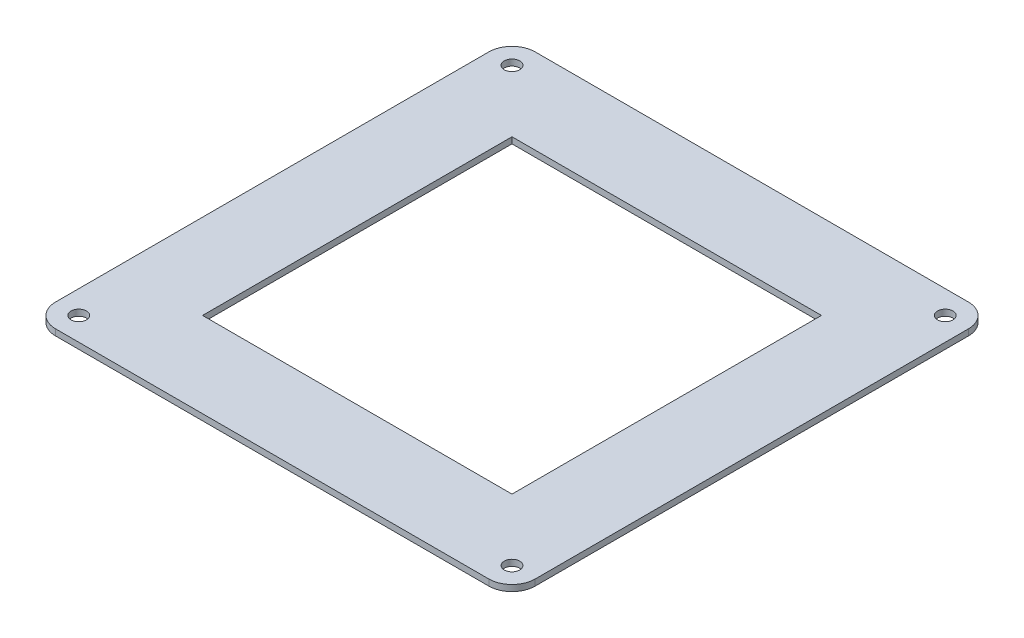
ISO-10303-21;
HEADER;
FILE_DESCRIPTION(('STEP AP214'),'2;1');
FILE_NAME('part.step','',(''),(''),'','','');
FILE_SCHEMA(('AUTOMOTIVE_DESIGN { 1 0 10303 214 1 1 1 1 }'));
ENDSEC;
DATA;
#1=APPLICATION_CONTEXT('core data for automotive mechanical design processes');
#2=APPLICATION_PROTOCOL_DEFINITION('international standard','automotive_design',2000,#1);
#3=PRODUCT_CONTEXT('',#1,'mechanical');
#4=PRODUCT('Part','Part','',(#3));
#5=PRODUCT_RELATED_PRODUCT_CATEGORY('part','',(#4));
#6=PRODUCT_DEFINITION_FORMATION('','',#4);
#7=PRODUCT_DEFINITION_CONTEXT('part definition',#1,'design');
#8=PRODUCT_DEFINITION('design','',#6,#7);
#9=PRODUCT_DEFINITION_SHAPE('','',#8);
#10=(LENGTH_UNIT() NAMED_UNIT(*) SI_UNIT(.MILLI.,.METRE.));
#11=(NAMED_UNIT(*) PLANE_ANGLE_UNIT() SI_UNIT($,.RADIAN.));
#12=(NAMED_UNIT(*) SI_UNIT($,.STERADIAN.) SOLID_ANGLE_UNIT());
#13=UNCERTAINTY_MEASURE_WITH_UNIT(LENGTH_MEASURE(1.E-05),#10,'distance_accuracy_value','');
#14=(GEOMETRIC_REPRESENTATION_CONTEXT(3) GLOBAL_UNCERTAINTY_ASSIGNED_CONTEXT((#13)) GLOBAL_UNIT_ASSIGNED_CONTEXT((#10,
#11,#12)) REPRESENTATION_CONTEXT('',''));
#15=CARTESIAN_POINT('',(0.,0.,0.));
#16=DIRECTION('',(0.,0.,1.));
#17=DIRECTION('',(1.,0.,0.));
#18=AXIS2_PLACEMENT_3D('',#15,#16,#17);
#19=CARTESIAN_POINT('',(17.5,2.,-157.5));
#20=DIRECTION('',(0.,1.,0.));
#21=DIRECTION('',(0.,0.,1.));
#22=AXIS2_PLACEMENT_3D('',#19,#20,#21);
#23=PLANE('',#22);
#24=DIRECTION('',(0.,0.,-1.));
#25=VECTOR('',#24,1.);
#26=CARTESIAN_POINT('',(137.5,2.,-37.5));
#27=LINE('',#26,#25);
#28=CARTESIAN_POINT('',(137.5,2.,-37.5));
#29=VERTEX_POINT('',#28);
#30=CARTESIAN_POINT('',(137.5,2.,-137.5));
#31=VERTEX_POINT('',#30);
#32=EDGE_CURVE('E47',#29,#31,#27,.T.);
#33=ORIENTED_EDGE('',*,*,#32,.F.);
#34=DIRECTION('',(1.,0.,0.));
#35=VECTOR('',#34,1.);
#36=CARTESIAN_POINT('',(37.5,2.,-37.5));
#37=LINE('',#36,#35);
#38=CARTESIAN_POINT('',(37.5,2.,-37.5));
#39=VERTEX_POINT('',#38);
#40=EDGE_CURVE('E139',#39,#29,#37,.T.);
#41=ORIENTED_EDGE('',*,*,#40,.F.);
#42=DIRECTION('',(0.,0.,1.));
#43=VECTOR('',#42,1.);
#44=CARTESIAN_POINT('',(37.5,2.,-37.5));
#45=LINE('',#44,#43);
#46=CARTESIAN_POINT('',(37.5,2.,-137.5));
#47=VERTEX_POINT('',#46);
#48=EDGE_CURVE('E124',#47,#39,#45,.T.);
#49=ORIENTED_EDGE('',*,*,#48,.F.);
#50=DIRECTION('',(-1.,0.,0.));
#51=VECTOR('',#50,1.);
#52=CARTESIAN_POINT('',(37.5,2.,-137.5));
#53=LINE('',#52,#51);
#54=EDGE_CURVE('E133',#31,#47,#53,.T.);
#55=ORIENTED_EDGE('',*,*,#54,.F.);
#56=EDGE_LOOP('',(#33,#41,#49,#55));
#57=FACE_BOUND('',#56,.T.);
#58=CARTESIAN_POINT('',(157.5,2.,-17.5));
#59=DIRECTION('',(0.,1.,0.));
#60=DIRECTION('',(0.,0.,1.));
#61=AXIS2_PLACEMENT_3D('',#58,#59,#60);
#62=CIRCLE('',#61,2.5);
#63=CARTESIAN_POINT('',(157.5,2.,-15.));
#64=VERTEX_POINT('',#63);
#65=EDGE_CURVE('E155',#64,#64,#62,.T.);
#66=ORIENTED_EDGE('',*,*,#65,.F.);
#67=EDGE_LOOP('',(#66));
#68=FACE_BOUND('',#67,.T.);
#69=CARTESIAN_POINT('',(17.5,2.,-157.5));
#70=DIRECTION('',(0.,1.,0.));
#71=DIRECTION('',(0.,0.,1.));
#72=AXIS2_PLACEMENT_3D('',#69,#70,#71);
#73=CIRCLE('',#72,2.5);
#74=CARTESIAN_POINT('',(17.5,2.,-155.));
#75=VERTEX_POINT('',#74);
#76=EDGE_CURVE('E167',#75,#75,#73,.T.);
#77=ORIENTED_EDGE('',*,*,#76,.F.);
#78=EDGE_LOOP('',(#77));
#79=FACE_BOUND('',#78,.T.);
#80=CARTESIAN_POINT('',(17.5,2.,-157.5));
#81=DIRECTION('',(0.,1.,0.));
#82=DIRECTION('',(0.,0.,1.));
#83=AXIS2_PLACEMENT_3D('',#80,#81,#82);
#84=CIRCLE('',#83,7.5);
#85=CARTESIAN_POINT('',(17.5,2.,-165.));
#86=VERTEX_POINT('',#85);
#87=CARTESIAN_POINT('',(10.,2.,-157.5));
#88=VERTEX_POINT('',#87);
#89=EDGE_CURVE('E173',#86,#88,#84,.T.);
#90=ORIENTED_EDGE('',*,*,#89,.T.);
#91=DIRECTION('',(0.,0.,1.));
#92=VECTOR('',#91,1.);
#93=CARTESIAN_POINT('',(10.,2.,-17.5));
#94=LINE('',#93,#92);
#95=CARTESIAN_POINT('',(10.,2.,-17.5));
#96=VERTEX_POINT('',#95);
#97=EDGE_CURVE('E176',#88,#96,#94,.T.);
#98=ORIENTED_EDGE('',*,*,#97,.T.);
#99=CARTESIAN_POINT('',(17.5,2.,-17.5));
#100=DIRECTION('',(0.,1.,0.));
#101=DIRECTION('',(0.,0.,1.));
#102=AXIS2_PLACEMENT_3D('',#99,#100,#101);
#103=CIRCLE('',#102,7.5);
#104=CARTESIAN_POINT('',(17.5,2.,-10.));
#105=VERTEX_POINT('',#104);
#106=EDGE_CURVE('E179',#96,#105,#103,.T.);
#107=ORIENTED_EDGE('',*,*,#106,.T.);
#108=DIRECTION('',(1.,0.,0.));
#109=VECTOR('',#108,1.);
#110=CARTESIAN_POINT('',(17.5,2.,-10.));
#111=LINE('',#110,#109);
#112=CARTESIAN_POINT('',(157.5,2.,-9.99999999999999));
#113=VERTEX_POINT('',#112);
#114=EDGE_CURVE('E181',#105,#113,#111,.T.);
#115=ORIENTED_EDGE('',*,*,#114,.T.);
#116=CARTESIAN_POINT('',(157.5,2.,-17.5));
#117=DIRECTION('',(0.,1.,0.));
#118=DIRECTION('',(0.,0.,1.));
#119=AXIS2_PLACEMENT_3D('',#116,#117,#118);
#120=CIRCLE('',#119,7.50000000000002);
#121=CARTESIAN_POINT('',(165.,2.,-17.5));
#122=VERTEX_POINT('',#121);
#123=EDGE_CURVE('E183',#113,#122,#120,.T.);
#124=ORIENTED_EDGE('',*,*,#123,.T.);
#125=DIRECTION('',(0.,0.,-1.));
#126=VECTOR('',#125,1.);
#127=CARTESIAN_POINT('',(165.,2.,-17.5));
#128=LINE('',#127,#126);
#129=CARTESIAN_POINT('',(165.,2.,-157.5));
#130=VERTEX_POINT('',#129);
#131=EDGE_CURVE('E185',#122,#130,#128,.T.);
#132=ORIENTED_EDGE('',*,*,#131,.T.);
#133=CARTESIAN_POINT('',(157.5,2.,-157.5));
#134=DIRECTION('',(0.,1.,0.));
#135=DIRECTION('',(0.,0.,1.));
#136=AXIS2_PLACEMENT_3D('',#133,#134,#135);
#137=CIRCLE('',#136,7.50000000000001);
#138=CARTESIAN_POINT('',(157.5,2.,-165.));
#139=VERTEX_POINT('',#138);
#140=EDGE_CURVE('E187',#130,#139,#137,.T.);
#141=ORIENTED_EDGE('',*,*,#140,.T.);
#142=DIRECTION('',(-1.,0.,0.));
#143=VECTOR('',#142,1.);
#144=CARTESIAN_POINT('',(17.5,2.,-165.));
#145=LINE('',#144,#143);
#146=EDGE_CURVE('E189',#139,#86,#145,.T.);
#147=ORIENTED_EDGE('',*,*,#146,.T.);
#148=EDGE_LOOP('',(#90,#98,#107,#115,#124,#132,#141,#147));
#149=FACE_BOUND('',#148,.T.);
#150=CARTESIAN_POINT('',(157.5,2.,-157.5));
#151=DIRECTION('',(0.,1.,0.));
#152=DIRECTION('',(0.,0.,1.));
#153=AXIS2_PLACEMENT_3D('',#150,#151,#152);
#154=CIRCLE('',#153,2.5);
#155=CARTESIAN_POINT('',(157.5,2.,-155.));
#156=VERTEX_POINT('',#155);
#157=EDGE_CURVE('E161',#156,#156,#154,.T.);
#158=ORIENTED_EDGE('',*,*,#157,.F.);
#159=EDGE_LOOP('',(#158));
#160=FACE_BOUND('',#159,.T.);
#161=CARTESIAN_POINT('',(17.5,2.,-17.5));
#162=DIRECTION('',(0.,1.,0.));
#163=DIRECTION('',(0.,0.,1.));
#164=AXIS2_PLACEMENT_3D('',#161,#162,#163);
#165=CIRCLE('',#164,2.5);
#166=CARTESIAN_POINT('',(17.5,2.,-15.));
#167=VERTEX_POINT('',#166);
#168=EDGE_CURVE('E149',#167,#167,#165,.T.);
#169=ORIENTED_EDGE('',*,*,#168,.F.);
#170=EDGE_LOOP('',(#169));
#171=FACE_BOUND('',#170,.T.);
#172=ADVANCED_FACE('F32',(#57,#68,#79,#149,#160,#171),#23,.T.);
#173=CARTESIAN_POINT('',(17.5,0.,-157.5));
#174=DIRECTION('',(0.,1.,0.));
#175=DIRECTION('',(0.,0.,1.));
#176=AXIS2_PLACEMENT_3D('',#173,#174,#175);
#177=PLANE('',#176);
#178=DIRECTION('',(1.,0.,0.));
#179=VECTOR('',#178,1.);
#180=CARTESIAN_POINT('',(17.5,0.,-37.5));
#181=LINE('',#180,#179);
#182=CARTESIAN_POINT('',(37.5,0.,-37.5));
#183=VERTEX_POINT('',#182);
#184=CARTESIAN_POINT('',(137.5,0.,-37.5));
#185=VERTEX_POINT('',#184);
#186=EDGE_CURVE('E40',#183,#185,#181,.T.);
#187=ORIENTED_EDGE('',*,*,#186,.T.);
#188=DIRECTION('',(0.,0.,-1.));
#189=VECTOR('',#188,1.);
#190=CARTESIAN_POINT('',(137.5,0.,-157.5));
#191=LINE('',#190,#189);
#192=CARTESIAN_POINT('',(137.5,0.,-137.5));
#193=VERTEX_POINT('',#192);
#194=EDGE_CURVE('E11',#185,#193,#191,.T.);
#195=ORIENTED_EDGE('',*,*,#194,.T.);
#196=DIRECTION('',(-1.,0.,0.));
#197=VECTOR('',#196,1.);
#198=CARTESIAN_POINT('',(17.5,0.,-137.5));
#199=LINE('',#198,#197);
#200=CARTESIAN_POINT('',(37.5,0.,-137.5));
#201=VERTEX_POINT('',#200);
#202=EDGE_CURVE('E230',#193,#201,#199,.T.);
#203=ORIENTED_EDGE('',*,*,#202,.T.);
#204=DIRECTION('',(0.,0.,1.));
#205=VECTOR('',#204,1.);
#206=CARTESIAN_POINT('',(37.5,0.,-157.5));
#207=LINE('',#206,#205);
#208=EDGE_CURVE('E127',#201,#183,#207,.T.);
#209=ORIENTED_EDGE('',*,*,#208,.T.);
#210=EDGE_LOOP('',(#187,#195,#203,#209));
#211=FACE_BOUND('',#210,.T.);
#212=CARTESIAN_POINT('',(17.5,0.,-157.5));
#213=DIRECTION('',(0.,1.,0.));
#214=DIRECTION('',(0.,0.,1.));
#215=AXIS2_PLACEMENT_3D('',#212,#213,#214);
#216=CIRCLE('',#215,7.5);
#217=CARTESIAN_POINT('',(17.5,0.,-165.));
#218=VERTEX_POINT('',#217);
#219=CARTESIAN_POINT('',(10.,0.,-157.5));
#220=VERTEX_POINT('',#219);
#221=EDGE_CURVE('E170',#218,#220,#216,.T.);
#222=ORIENTED_EDGE('',*,*,#221,.F.);
#223=DIRECTION('',(-1.,0.,0.));
#224=VECTOR('',#223,1.);
#225=CARTESIAN_POINT('',(17.5,0.,-165.));
#226=LINE('',#225,#224);
#227=CARTESIAN_POINT('',(157.5,0.,-165.));
#228=VERTEX_POINT('',#227);
#229=EDGE_CURVE('E177',#228,#218,#226,.T.);
#230=ORIENTED_EDGE('',*,*,#229,.F.);
#231=CARTESIAN_POINT('',(157.5,0.,-157.5));
#232=DIRECTION('',(0.,1.,0.));
#233=DIRECTION('',(0.,0.,1.));
#234=AXIS2_PLACEMENT_3D('',#231,#232,#233);
#235=CIRCLE('',#234,7.50000000000001);
#236=CARTESIAN_POINT('',(165.,0.,-157.5));
#237=VERTEX_POINT('',#236);
#238=EDGE_CURVE('E204',#237,#228,#235,.T.);
#239=ORIENTED_EDGE('',*,*,#238,.F.);
#240=DIRECTION('',(0.,0.,-1.));
#241=VECTOR('',#240,1.);
#242=CARTESIAN_POINT('',(165.,0.,-17.5));
#243=LINE('',#242,#241);
#244=CARTESIAN_POINT('',(165.,0.,-17.5));
#245=VERTEX_POINT('',#244);
#246=EDGE_CURVE('E202',#245,#237,#243,.T.);
#247=ORIENTED_EDGE('',*,*,#246,.F.);
#248=CARTESIAN_POINT('',(157.5,0.,-17.5));
#249=DIRECTION('',(0.,1.,0.));
#250=DIRECTION('',(0.,0.,1.));
#251=AXIS2_PLACEMENT_3D('',#248,#249,#250);
#252=CIRCLE('',#251,7.50000000000002);
#253=CARTESIAN_POINT('',(157.5,0.,-9.99999999999999));
#254=VERTEX_POINT('',#253);
#255=EDGE_CURVE('E200',#254,#245,#252,.T.);
#256=ORIENTED_EDGE('',*,*,#255,.F.);
#257=DIRECTION('',(1.,0.,0.));
#258=VECTOR('',#257,1.);
#259=CARTESIAN_POINT('',(17.5,0.,-10.));
#260=LINE('',#259,#258);
#261=CARTESIAN_POINT('',(17.5,0.,-10.));
#262=VERTEX_POINT('',#261);
#263=EDGE_CURVE('E198',#262,#254,#260,.T.);
#264=ORIENTED_EDGE('',*,*,#263,.F.);
#265=CARTESIAN_POINT('',(17.5,0.,-17.5));
#266=DIRECTION('',(0.,1.,0.));
#267=DIRECTION('',(0.,0.,1.));
#268=AXIS2_PLACEMENT_3D('',#265,#266,#267);
#269=CIRCLE('',#268,7.5);
#270=CARTESIAN_POINT('',(10.,0.,-17.5));
#271=VERTEX_POINT('',#270);
#272=EDGE_CURVE('E196',#271,#262,#269,.T.);
#273=ORIENTED_EDGE('',*,*,#272,.F.);
#274=DIRECTION('',(0.,0.,1.));
#275=VECTOR('',#274,1.);
#276=CARTESIAN_POINT('',(10.,0.,-17.5));
#277=LINE('',#276,#275);
#278=EDGE_CURVE('E194',#220,#271,#277,.T.);
#279=ORIENTED_EDGE('',*,*,#278,.F.);
#280=EDGE_LOOP('',(#222,#230,#239,#247,#256,#264,#273,#279));
#281=FACE_BOUND('',#280,.T.);
#282=CARTESIAN_POINT('',(17.5,0.,-157.5));
#283=DIRECTION('',(0.,1.,0.));
#284=DIRECTION('',(0.,0.,1.));
#285=AXIS2_PLACEMENT_3D('',#282,#283,#284);
#286=CIRCLE('',#285,2.5);
#287=CARTESIAN_POINT('',(17.5,0.,-155.));
#288=VERTEX_POINT('',#287);
#289=EDGE_CURVE('E164',#288,#288,#286,.T.);
#290=ORIENTED_EDGE('',*,*,#289,.T.);
#291=EDGE_LOOP('',(#290));
#292=FACE_BOUND('',#291,.T.);
#293=CARTESIAN_POINT('',(157.5,0.,-157.5));
#294=DIRECTION('',(0.,1.,0.));
#295=DIRECTION('',(0.,0.,1.));
#296=AXIS2_PLACEMENT_3D('',#293,#294,#295);
#297=CIRCLE('',#296,2.5);
#298=CARTESIAN_POINT('',(157.5,0.,-155.));
#299=VERTEX_POINT('',#298);
#300=EDGE_CURVE('E158',#299,#299,#297,.T.);
#301=ORIENTED_EDGE('',*,*,#300,.T.);
#302=EDGE_LOOP('',(#301));
#303=FACE_BOUND('',#302,.T.);
#304=CARTESIAN_POINT('',(157.5,0.,-17.5));
#305=DIRECTION('',(0.,1.,0.));
#306=DIRECTION('',(0.,0.,1.));
#307=AXIS2_PLACEMENT_3D('',#304,#305,#306);
#308=CIRCLE('',#307,2.5);
#309=CARTESIAN_POINT('',(157.5,0.,-15.));
#310=VERTEX_POINT('',#309);
#311=EDGE_CURVE('E152',#310,#310,#308,.T.);
#312=ORIENTED_EDGE('',*,*,#311,.T.);
#313=EDGE_LOOP('',(#312));
#314=FACE_BOUND('',#313,.T.);
#315=CARTESIAN_POINT('',(17.5,0.,-17.5));
#316=DIRECTION('',(0.,1.,0.));
#317=DIRECTION('',(0.,0.,1.));
#318=AXIS2_PLACEMENT_3D('',#315,#316,#317);
#319=CIRCLE('',#318,2.5);
#320=CARTESIAN_POINT('',(17.5,0.,-15.));
#321=VERTEX_POINT('',#320);
#322=EDGE_CURVE('E146',#321,#321,#319,.T.);
#323=ORIENTED_EDGE('',*,*,#322,.T.);
#324=EDGE_LOOP('',(#323));
#325=FACE_BOUND('',#324,.T.);
#326=ADVANCED_FACE('F234',(#211,#281,#292,#303,#314,#325),#177,.F.);
#327=CARTESIAN_POINT('',(17.5,2.,-157.5));
#328=DIRECTION('',(0.,-1.,0.));
#329=DIRECTION('',(0.,0.,-1.));
#330=AXIS2_PLACEMENT_3D('',#327,#328,#329);
#331=CYLINDRICAL_SURFACE('',#330,7.5);
#332=ORIENTED_EDGE('',*,*,#221,.T.);
#333=DIRECTION('',(0.,-1.,0.));
#334=VECTOR('',#333,1.);
#335=CARTESIAN_POINT('',(10.,2.,-157.5));
#336=LINE('',#335,#334);
#337=EDGE_CURVE('E227',#88,#220,#336,.T.);
#338=ORIENTED_EDGE('',*,*,#337,.F.);
#339=ORIENTED_EDGE('',*,*,#89,.F.);
#340=DIRECTION('',(0.,-1.,0.));
#341=VECTOR('',#340,1.);
#342=CARTESIAN_POINT('',(17.5,2.,-165.));
#343=LINE('',#342,#341);
#344=EDGE_CURVE('E191',#86,#218,#343,.T.);
#345=ORIENTED_EDGE('',*,*,#344,.T.);
#346=EDGE_LOOP('',(#332,#338,#339,#345));
#347=FACE_BOUND('',#346,.T.);
#348=ADVANCED_FACE('F34',(#347),#331,.T.);
#349=CARTESIAN_POINT('',(10.,2.,-17.5));
#350=DIRECTION('',(1.,0.,0.));
#351=DIRECTION('',(0.,0.,-1.));
#352=AXIS2_PLACEMENT_3D('',#349,#350,#351);
#353=PLANE('',#352);
#354=ORIENTED_EDGE('',*,*,#278,.T.);
#355=DIRECTION('',(0.,-1.,0.));
#356=VECTOR('',#355,1.);
#357=CARTESIAN_POINT('',(10.,2.,-17.5));
#358=LINE('',#357,#356);
#359=EDGE_CURVE('E224',#96,#271,#358,.T.);
#360=ORIENTED_EDGE('',*,*,#359,.F.);
#361=ORIENTED_EDGE('',*,*,#97,.F.);
#362=ORIENTED_EDGE('',*,*,#337,.T.);
#363=EDGE_LOOP('',(#354,#360,#361,#362));
#364=FACE_BOUND('',#363,.T.);
#365=ADVANCED_FACE('F284',(#364),#353,.F.);
#366=CARTESIAN_POINT('',(17.5,2.,-17.5));
#367=DIRECTION('',(0.,-1.,0.));
#368=DIRECTION('',(0.,0.,-1.));
#369=AXIS2_PLACEMENT_3D('',#366,#367,#368);
#370=CYLINDRICAL_SURFACE('',#369,7.5);
#371=ORIENTED_EDGE('',*,*,#272,.T.);
#372=DIRECTION('',(0.,-1.,0.));
#373=VECTOR('',#372,1.);
#374=CARTESIAN_POINT('',(17.5,2.,-10.));
#375=LINE('',#374,#373);
#376=EDGE_CURVE('E221',#105,#262,#375,.T.);
#377=ORIENTED_EDGE('',*,*,#376,.F.);
#378=ORIENTED_EDGE('',*,*,#106,.F.);
#379=ORIENTED_EDGE('',*,*,#359,.T.);
#380=EDGE_LOOP('',(#371,#377,#378,#379));
#381=FACE_BOUND('',#380,.T.);
#382=ADVANCED_FACE('F281',(#381),#370,.T.);
#383=CARTESIAN_POINT('',(17.5,2.,-10.));
#384=DIRECTION('',(0.,0.,-1.));
#385=DIRECTION('',(-1.,0.,0.));
#386=AXIS2_PLACEMENT_3D('',#383,#384,#385);
#387=PLANE('',#386);
#388=ORIENTED_EDGE('',*,*,#263,.T.);
#389=DIRECTION('',(0.,-1.,0.));
#390=VECTOR('',#389,1.);
#391=CARTESIAN_POINT('',(157.5,2.,-9.99999999999999));
#392=LINE('',#391,#390);
#393=EDGE_CURVE('E218',#113,#254,#392,.T.);
#394=ORIENTED_EDGE('',*,*,#393,.F.);
#395=ORIENTED_EDGE('',*,*,#114,.F.);
#396=ORIENTED_EDGE('',*,*,#376,.T.);
#397=EDGE_LOOP('',(#388,#394,#395,#396));
#398=FACE_BOUND('',#397,.T.);
#399=ADVANCED_FACE('F277',(#398),#387,.F.);
#400=CARTESIAN_POINT('',(157.5,2.,-17.5));
#401=DIRECTION('',(0.,-1.,0.));
#402=DIRECTION('',(0.,0.,-1.));
#403=AXIS2_PLACEMENT_3D('',#400,#401,#402);
#404=CYLINDRICAL_SURFACE('',#403,7.50000000000002);
#405=ORIENTED_EDGE('',*,*,#255,.T.);
#406=DIRECTION('',(0.,-1.,0.));
#407=VECTOR('',#406,1.);
#408=CARTESIAN_POINT('',(165.,2.,-17.5));
#409=LINE('',#408,#407);
#410=EDGE_CURVE('E215',#122,#245,#409,.T.);
#411=ORIENTED_EDGE('',*,*,#410,.F.);
#412=ORIENTED_EDGE('',*,*,#123,.F.);
#413=ORIENTED_EDGE('',*,*,#393,.T.);
#414=EDGE_LOOP('',(#405,#411,#412,#413));
#415=FACE_BOUND('',#414,.T.);
#416=ADVANCED_FACE('F273',(#415),#404,.T.);
#417=CARTESIAN_POINT('',(165.,2.,-17.5));
#418=DIRECTION('',(-1.,0.,0.));
#419=DIRECTION('',(0.,0.,1.));
#420=AXIS2_PLACEMENT_3D('',#417,#418,#419);
#421=PLANE('',#420);
#422=ORIENTED_EDGE('',*,*,#246,.T.);
#423=DIRECTION('',(0.,-1.,0.));
#424=VECTOR('',#423,1.);
#425=CARTESIAN_POINT('',(165.,2.,-157.5));
#426=LINE('',#425,#424);
#427=EDGE_CURVE('E212',#130,#237,#426,.T.);
#428=ORIENTED_EDGE('',*,*,#427,.F.);
#429=ORIENTED_EDGE('',*,*,#131,.F.);
#430=ORIENTED_EDGE('',*,*,#410,.T.);
#431=EDGE_LOOP('',(#422,#428,#429,#430));
#432=FACE_BOUND('',#431,.T.);
#433=ADVANCED_FACE('F269',(#432),#421,.F.);
#434=CARTESIAN_POINT('',(157.5,2.,-157.5));
#435=DIRECTION('',(0.,-1.,0.));
#436=DIRECTION('',(0.,0.,-1.));
#437=AXIS2_PLACEMENT_3D('',#434,#435,#436);
#438=CYLINDRICAL_SURFACE('',#437,7.50000000000001);
#439=ORIENTED_EDGE('',*,*,#238,.T.);
#440=DIRECTION('',(0.,-1.,0.));
#441=VECTOR('',#440,1.);
#442=CARTESIAN_POINT('',(157.5,2.,-165.));
#443=LINE('',#442,#441);
#444=EDGE_CURVE('E209',#139,#228,#443,.T.);
#445=ORIENTED_EDGE('',*,*,#444,.F.);
#446=ORIENTED_EDGE('',*,*,#140,.F.);
#447=ORIENTED_EDGE('',*,*,#427,.T.);
#448=EDGE_LOOP('',(#439,#445,#446,#447));
#449=FACE_BOUND('',#448,.T.);
#450=ADVANCED_FACE('F265',(#449),#438,.T.);
#451=CARTESIAN_POINT('',(17.5,2.,-165.));
#452=DIRECTION('',(0.,0.,1.));
#453=DIRECTION('',(1.,0.,0.));
#454=AXIS2_PLACEMENT_3D('',#451,#452,#453);
#455=PLANE('',#454);
#456=ORIENTED_EDGE('',*,*,#229,.T.);
#457=ORIENTED_EDGE('',*,*,#344,.F.);
#458=ORIENTED_EDGE('',*,*,#146,.F.);
#459=ORIENTED_EDGE('',*,*,#444,.T.);
#460=EDGE_LOOP('',(#456,#457,#458,#459));
#461=FACE_BOUND('',#460,.T.);
#462=ADVANCED_FACE('F262',(#461),#455,.F.);
#463=CARTESIAN_POINT('',(17.5,2.,-157.5));
#464=DIRECTION('',(0.,-1.,0.));
#465=DIRECTION('',(0.,0.,-1.));
#466=AXIS2_PLACEMENT_3D('',#463,#464,#465);
#467=CYLINDRICAL_SURFACE('',#466,2.5);
#468=ORIENTED_EDGE('',*,*,#76,.T.);
#469=EDGE_LOOP('',(#468));
#470=FACE_BOUND('',#469,.T.);
#471=ORIENTED_EDGE('',*,*,#289,.F.);
#472=EDGE_LOOP('',(#471));
#473=FACE_BOUND('',#472,.T.);
#474=ADVANCED_FACE('F259',(#470,#473),#467,.F.);
#475=CARTESIAN_POINT('',(157.5,2.,-157.5));
#476=DIRECTION('',(0.,-1.,0.));
#477=DIRECTION('',(0.,0.,-1.));
#478=AXIS2_PLACEMENT_3D('',#475,#476,#477);
#479=CYLINDRICAL_SURFACE('',#478,2.5);
#480=ORIENTED_EDGE('',*,*,#157,.T.);
#481=EDGE_LOOP('',(#480));
#482=FACE_BOUND('',#481,.T.);
#483=ORIENTED_EDGE('',*,*,#300,.F.);
#484=EDGE_LOOP('',(#483));
#485=FACE_BOUND('',#484,.T.);
#486=ADVANCED_FACE('F324',(#482,#485),#479,.F.);
#487=CARTESIAN_POINT('',(157.5,2.,-17.5));
#488=DIRECTION('',(0.,-1.,0.));
#489=DIRECTION('',(0.,0.,-1.));
#490=AXIS2_PLACEMENT_3D('',#487,#488,#489);
#491=CYLINDRICAL_SURFACE('',#490,2.5);
#492=ORIENTED_EDGE('',*,*,#65,.T.);
#493=EDGE_LOOP('',(#492));
#494=FACE_BOUND('',#493,.T.);
#495=ORIENTED_EDGE('',*,*,#311,.F.);
#496=EDGE_LOOP('',(#495));
#497=FACE_BOUND('',#496,.T.);
#498=ADVANCED_FACE('F248',(#494,#497),#491,.F.);
#499=CARTESIAN_POINT('',(17.5,2.,-17.5));
#500=DIRECTION('',(0.,-1.,0.));
#501=DIRECTION('',(0.,0.,-1.));
#502=AXIS2_PLACEMENT_3D('',#499,#500,#501);
#503=CYLINDRICAL_SURFACE('',#502,2.5);
#504=ORIENTED_EDGE('',*,*,#168,.T.);
#505=EDGE_LOOP('',(#504));
#506=FACE_BOUND('',#505,.T.);
#507=ORIENTED_EDGE('',*,*,#322,.F.);
#508=EDGE_LOOP('',(#507));
#509=FACE_BOUND('',#508,.T.);
#510=ADVANCED_FACE('F241',(#506,#509),#503,.F.);
#511=CARTESIAN_POINT('',(137.5,-8.,-37.5));
#512=DIRECTION('',(1.,0.,0.));
#513=DIRECTION('',(0.,0.,-1.));
#514=AXIS2_PLACEMENT_3D('',#511,#512,#513);
#515=PLANE('',#514);
#516=DIRECTION('',(0.,1.,0.));
#517=VECTOR('',#516,1.);
#518=CARTESIAN_POINT('',(137.5,-8.,-37.5));
#519=LINE('',#518,#517);
#520=EDGE_CURVE('E144',#185,#29,#519,.T.);
#521=ORIENTED_EDGE('',*,*,#520,.T.);
#522=ORIENTED_EDGE('',*,*,#32,.T.);
#523=DIRECTION('',(0.,1.,0.));
#524=VECTOR('',#523,1.);
#525=CARTESIAN_POINT('',(137.5,-8.,-137.5));
#526=LINE('',#525,#524);
#527=EDGE_CURVE('E130',#193,#31,#526,.T.);
#528=ORIENTED_EDGE('',*,*,#527,.F.);
#529=ORIENTED_EDGE('',*,*,#194,.F.);
#530=EDGE_LOOP('',(#521,#522,#528,#529));
#531=FACE_BOUND('',#530,.T.);
#532=ADVANCED_FACE('F239',(#531),#515,.F.);
#533=CARTESIAN_POINT('',(37.5,-8.,-37.5));
#534=DIRECTION('',(0.,0.,1.));
#535=DIRECTION('',(1.,0.,0.));
#536=AXIS2_PLACEMENT_3D('',#533,#534,#535);
#537=PLANE('',#536);
#538=DIRECTION('',(0.,1.,0.));
#539=VECTOR('',#538,1.);
#540=CARTESIAN_POINT('',(37.5,-8.,-37.5));
#541=LINE('',#540,#539);
#542=EDGE_CURVE('E129',#183,#39,#541,.T.);
#543=ORIENTED_EDGE('',*,*,#542,.T.);
#544=ORIENTED_EDGE('',*,*,#40,.T.);
#545=ORIENTED_EDGE('',*,*,#520,.F.);
#546=ORIENTED_EDGE('',*,*,#186,.F.);
#547=EDGE_LOOP('',(#543,#544,#545,#546));
#548=FACE_BOUND('',#547,.T.);
#549=ADVANCED_FACE('F238',(#548),#537,.F.);
#550=CARTESIAN_POINT('',(37.5,-8.,-37.5));
#551=DIRECTION('',(-1.,0.,0.));
#552=DIRECTION('',(0.,0.,1.));
#553=AXIS2_PLACEMENT_3D('',#550,#551,#552);
#554=PLANE('',#553);
#555=DIRECTION('',(0.,1.,0.));
#556=VECTOR('',#555,1.);
#557=CARTESIAN_POINT('',(37.5,-8.,-137.5));
#558=LINE('',#557,#556);
#559=EDGE_CURVE('E55',#201,#47,#558,.T.);
#560=ORIENTED_EDGE('',*,*,#559,.T.);
#561=ORIENTED_EDGE('',*,*,#48,.T.);
#562=ORIENTED_EDGE('',*,*,#542,.F.);
#563=ORIENTED_EDGE('',*,*,#208,.F.);
#564=EDGE_LOOP('',(#560,#561,#562,#563));
#565=FACE_BOUND('',#564,.T.);
#566=ADVANCED_FACE('F121',(#565),#554,.F.);
#567=CARTESIAN_POINT('',(37.5,-8.,-137.5));
#568=DIRECTION('',(0.,0.,-1.));
#569=DIRECTION('',(-1.,0.,0.));
#570=AXIS2_PLACEMENT_3D('',#567,#568,#569);
#571=PLANE('',#570);
#572=ORIENTED_EDGE('',*,*,#527,.T.);
#573=ORIENTED_EDGE('',*,*,#54,.T.);
#574=ORIENTED_EDGE('',*,*,#559,.F.);
#575=ORIENTED_EDGE('',*,*,#202,.F.);
#576=EDGE_LOOP('',(#572,#573,#574,#575));
#577=FACE_BOUND('',#576,.T.);
#578=ADVANCED_FACE('F134',(#577),#571,.F.);
#579=CLOSED_SHELL('',(#172,#326,#348,#365,#382,#399,#416,#433,#450,#462,#474,#486,#498,#510,
#532,#549,#566,#578));
#580=MANIFOLD_SOLID_BREP('B2',#579);
#581=ADVANCED_BREP_SHAPE_REPRESENTATION('',(#18,#580),#14);
#582=SHAPE_DEFINITION_REPRESENTATION(#9,#581);
ENDSEC;
END-ISO-10303-21;
